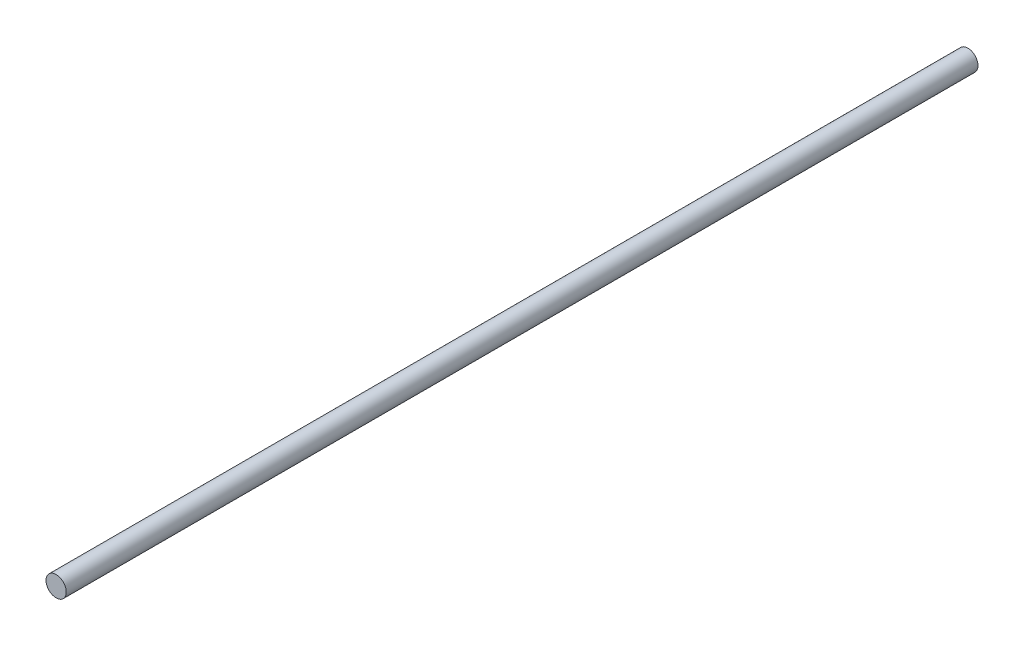
ISO-10303-21;
HEADER;
FILE_DESCRIPTION(('STEP AP214'),'2;1');
FILE_NAME('part.step','',(''),(''),'','','');
FILE_SCHEMA(('AUTOMOTIVE_DESIGN { 1 0 10303 214 1 1 1 1 }'));
ENDSEC;
DATA;
#1=APPLICATION_CONTEXT('core data for automotive mechanical design processes');
#2=APPLICATION_PROTOCOL_DEFINITION('international standard','automotive_design',2000,#1);
#3=PRODUCT_CONTEXT('',#1,'mechanical');
#4=PRODUCT('Part','Part','',(#3));
#5=PRODUCT_RELATED_PRODUCT_CATEGORY('part','',(#4));
#6=PRODUCT_DEFINITION_FORMATION('','',#4);
#7=PRODUCT_DEFINITION_CONTEXT('part definition',#1,'design');
#8=PRODUCT_DEFINITION('design','',#6,#7);
#9=PRODUCT_DEFINITION_SHAPE('','',#8);
#10=(LENGTH_UNIT() NAMED_UNIT(*) SI_UNIT(.MILLI.,.METRE.));
#11=(NAMED_UNIT(*) PLANE_ANGLE_UNIT() SI_UNIT($,.RADIAN.));
#12=(NAMED_UNIT(*) SI_UNIT($,.STERADIAN.) SOLID_ANGLE_UNIT());
#13=UNCERTAINTY_MEASURE_WITH_UNIT(LENGTH_MEASURE(1.E-05),#10,'distance_accuracy_value','');
#14=(GEOMETRIC_REPRESENTATION_CONTEXT(3) GLOBAL_UNCERTAINTY_ASSIGNED_CONTEXT((#13)) GLOBAL_UNIT_ASSIGNED_CONTEXT((#10,
#11,#12)) REPRESENTATION_CONTEXT('',''));
#15=CARTESIAN_POINT('',(0.,0.,0.));
#16=DIRECTION('',(0.,0.,1.));
#17=DIRECTION('',(1.,0.,0.));
#18=AXIS2_PLACEMENT_3D('',#15,#16,#17);
#19=CARTESIAN_POINT('',(0.,0.,360.));
#20=DIRECTION('',(0.,0.,-1.));
#21=DIRECTION('',(-1.,0.,0.));
#22=AXIS2_PLACEMENT_3D('',#19,#20,#21);
#23=CYLINDRICAL_SURFACE('',#22,4.);
#24=CARTESIAN_POINT('',(0.,0.,360.));
#25=DIRECTION('',(0.,0.,1.));
#26=DIRECTION('',(1.,0.,0.));
#27=AXIS2_PLACEMENT_3D('',#24,#25,#26);
#28=CIRCLE('',#27,4.);
#29=CARTESIAN_POINT('',(-4.,0.,360.));
#30=VERTEX_POINT('',#29);
#31=EDGE_CURVE('E10',#30,#30,#28,.T.);
#32=CARTESIAN_POINT('',(0.,0.,0.));
#33=DIRECTION('',(0.,0.,1.));
#34=DIRECTION('',(1.,0.,0.));
#35=AXIS2_PLACEMENT_3D('',#32,#33,#34);
#36=CIRCLE('',#35,4.);
#37=CARTESIAN_POINT('',(-4.,0.,0.));
#38=VERTEX_POINT('',#37);
#39=EDGE_CURVE('E40',#38,#38,#36,.T.);
#40=CARTESIAN_POINT('',(-4.,0.,360.));
#41=CARTESIAN_POINT('',(-4.,0.,356.25));
#42=CARTESIAN_POINT('',(-4.,0.,352.5));
#43=CARTESIAN_POINT('',(-4.,0.,345.));
#44=CARTESIAN_POINT('',(-4.,0.,341.25));
#45=CARTESIAN_POINT('',(-4.,0.,333.75));
#46=CARTESIAN_POINT('',(-4.,0.,330.));
#47=CARTESIAN_POINT('',(-4.,0.,322.5));
#48=CARTESIAN_POINT('',(-4.,0.,318.75));
#49=CARTESIAN_POINT('',(-4.,0.,311.25));
#50=CARTESIAN_POINT('',(-4.,0.,307.5));
#51=CARTESIAN_POINT('',(-4.,0.,300.));
#52=CARTESIAN_POINT('',(-4.,0.,296.25));
#53=CARTESIAN_POINT('',(-4.,0.,288.75));
#54=CARTESIAN_POINT('',(-4.,0.,285.));
#55=CARTESIAN_POINT('',(-4.,0.,277.5));
#56=CARTESIAN_POINT('',(-4.,0.,273.75));
#57=CARTESIAN_POINT('',(-4.,0.,266.25));
#58=CARTESIAN_POINT('',(-4.,0.,262.5));
#59=CARTESIAN_POINT('',(-4.,0.,255.));
#60=CARTESIAN_POINT('',(-4.,0.,251.25));
#61=CARTESIAN_POINT('',(-4.,0.,243.75));
#62=CARTESIAN_POINT('',(-4.,0.,240.));
#63=CARTESIAN_POINT('',(-4.,0.,232.5));
#64=CARTESIAN_POINT('',(-4.,0.,228.75));
#65=CARTESIAN_POINT('',(-4.,0.,221.25));
#66=CARTESIAN_POINT('',(-4.,0.,217.5));
#67=CARTESIAN_POINT('',(-4.,0.,210.));
#68=CARTESIAN_POINT('',(-4.,0.,206.25));
#69=CARTESIAN_POINT('',(-4.,0.,198.75));
#70=CARTESIAN_POINT('',(-4.,0.,195.));
#71=CARTESIAN_POINT('',(-4.,0.,187.5));
#72=CARTESIAN_POINT('',(-4.,0.,183.75));
#73=CARTESIAN_POINT('',(-4.,0.,176.25));
#74=CARTESIAN_POINT('',(-4.,0.,172.5));
#75=CARTESIAN_POINT('',(-4.,0.,165.));
#76=CARTESIAN_POINT('',(-4.,0.,161.25));
#77=CARTESIAN_POINT('',(-4.,0.,153.75));
#78=CARTESIAN_POINT('',(-4.,0.,150.));
#79=CARTESIAN_POINT('',(-4.,0.,142.5));
#80=CARTESIAN_POINT('',(-4.,0.,138.75));
#81=CARTESIAN_POINT('',(-4.,0.,131.25));
#82=CARTESIAN_POINT('',(-4.,0.,127.5));
#83=CARTESIAN_POINT('',(-4.,0.,120.));
#84=CARTESIAN_POINT('',(-4.,0.,116.25));
#85=CARTESIAN_POINT('',(-4.,0.,108.75));
#86=CARTESIAN_POINT('',(-4.,0.,105.));
#87=CARTESIAN_POINT('',(-4.,0.,97.5));
#88=CARTESIAN_POINT('',(-4.,0.,93.75));
#89=CARTESIAN_POINT('',(-4.,0.,86.25));
#90=CARTESIAN_POINT('',(-4.,0.,82.5));
#91=CARTESIAN_POINT('',(-4.,0.,75.));
#92=CARTESIAN_POINT('',(-4.,0.,71.25));
#93=CARTESIAN_POINT('',(-4.,0.,63.75));
#94=CARTESIAN_POINT('',(-4.,0.,60.));
#95=CARTESIAN_POINT('',(-4.,0.,52.5));
#96=CARTESIAN_POINT('',(-4.,0.,48.75));
#97=CARTESIAN_POINT('',(-4.,0.,41.25));
#98=CARTESIAN_POINT('',(-4.,0.,37.5));
#99=CARTESIAN_POINT('',(-4.,0.,30.));
#100=CARTESIAN_POINT('',(-4.,0.,26.25));
#101=CARTESIAN_POINT('',(-4.,0.,18.75));
#102=CARTESIAN_POINT('',(-4.,0.,14.9999999999999));
#103=CARTESIAN_POINT('',(-4.,0.,7.49999999999993));
#104=CARTESIAN_POINT('',(-4.,0.,3.74999999999994));
#105=CARTESIAN_POINT('',(-4.,0.,0.));
#106=B_SPLINE_CURVE_WITH_KNOTS('',3,(#40,#41,#42,#43,#44,#45,#46,#47,#48,#49,#50,#51,#52,#53,
#54,#55,#56,#57,#58,#59,#60,#61,#62,#63,#64,#65,#66,#67,#68,#69,#70,#71,#72,#73,#74,#75,#76,#77,
#78,#79,#80,#81,#82,#83,#84,#85,#86,#87,#88,#89,#90,#91,#92,#93,#94,#95,#96,#97,#98,#99,#100,
#101,#102,#103,#104,#105),.UNSPECIFIED.,.F.,.F.,(4,2,2,2,2,2,2,2,2,2,2,2,2,2,2,2,2,2,2,2,2,2,2,
2,2,2,2,2,2,2,2,2,4),(0.,11.25,22.5,33.7500000000001,45.,56.25,67.5,78.75,90.,101.25,112.5,
123.75,135.,146.25,157.5,168.75,180.,191.25,202.5,213.75,225.,236.25,247.5,258.75,270.,281.25,
292.5,303.75,315.,326.25,337.5,348.75,360.),.UNSPECIFIED.);
#107=EDGE_CURVE('BSEAM37',#30,#38,#106,.T.);
#108=ORIENTED_EDGE('',*,*,#31,.F.);
#109=ORIENTED_EDGE('',*,*,#39,.T.);
#110=ORIENTED_EDGE('',*,*,#107,.T.);
#111=ORIENTED_EDGE('',*,*,#107,.F.);
#112=EDGE_LOOP('',(#108,#110,#109,#111));
#113=FACE_BOUND('',#112,.T.);
#114=ADVANCED_FACE('F37',(#113),#23,.T.);
#115=CARTESIAN_POINT('',(0.,0.,360.));
#116=DIRECTION('',(0.,0.,1.));
#117=DIRECTION('',(1.,0.,0.));
#118=AXIS2_PLACEMENT_3D('',#115,#116,#117);
#119=PLANE('',#118);
#120=ORIENTED_EDGE('',*,*,#31,.T.);
#121=EDGE_LOOP('',(#120));
#122=FACE_BOUND('',#121,.T.);
#123=ADVANCED_FACE('F52',(#122),#119,.T.);
#124=CARTESIAN_POINT('',(0.,0.,0.));
#125=DIRECTION('',(0.,0.,1.));
#126=DIRECTION('',(1.,0.,0.));
#127=AXIS2_PLACEMENT_3D('',#124,#125,#126);
#128=PLANE('',#127);
#129=ORIENTED_EDGE('',*,*,#39,.F.);
#130=EDGE_LOOP('',(#129));
#131=FACE_BOUND('',#130,.T.);
#132=ADVANCED_FACE('F50',(#131),#128,.F.);
#133=CLOSED_SHELL('',(#114,#123,#132));
#134=MANIFOLD_SOLID_BREP('B2',#133);
#135=ADVANCED_BREP_SHAPE_REPRESENTATION('',(#18,#134),#14);
#136=SHAPE_DEFINITION_REPRESENTATION(#9,#135);
ENDSEC;
END-ISO-10303-21;
